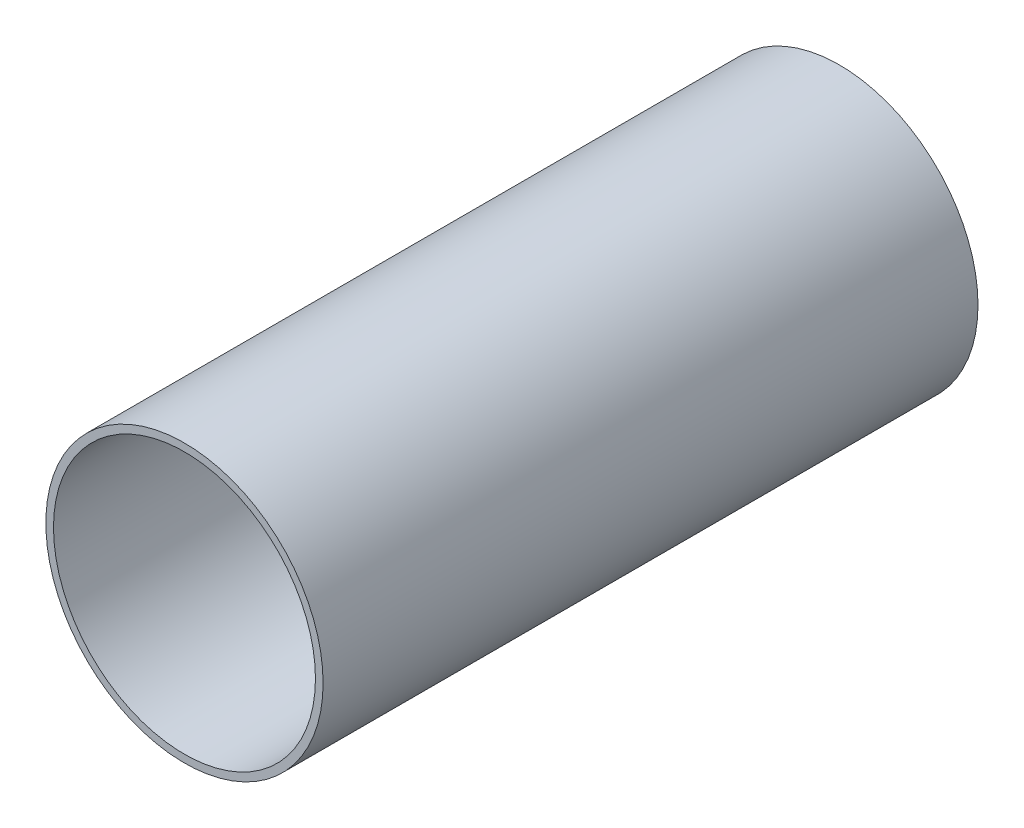
ISO-10303-21;
HEADER;
FILE_DESCRIPTION(('STEP AP214'),'2;1');
FILE_NAME('part.step','',(''),(''),'','','');
FILE_SCHEMA(('AUTOMOTIVE_DESIGN { 1 0 10303 214 1 1 1 1 }'));
ENDSEC;
DATA;
#1=APPLICATION_CONTEXT('core data for automotive mechanical design processes');
#2=APPLICATION_PROTOCOL_DEFINITION('international standard','automotive_design',2000,#1);
#3=PRODUCT_CONTEXT('',#1,'mechanical');
#4=PRODUCT('Part','Part','',(#3));
#5=PRODUCT_RELATED_PRODUCT_CATEGORY('part','',(#4));
#6=PRODUCT_DEFINITION_FORMATION('','',#4);
#7=PRODUCT_DEFINITION_CONTEXT('part definition',#1,'design');
#8=PRODUCT_DEFINITION('design','',#6,#7);
#9=PRODUCT_DEFINITION_SHAPE('','',#8);
#10=(LENGTH_UNIT() NAMED_UNIT(*) SI_UNIT(.MILLI.,.METRE.));
#11=(NAMED_UNIT(*) PLANE_ANGLE_UNIT() SI_UNIT($,.RADIAN.));
#12=(NAMED_UNIT(*) SI_UNIT($,.STERADIAN.) SOLID_ANGLE_UNIT());
#13=UNCERTAINTY_MEASURE_WITH_UNIT(LENGTH_MEASURE(1.E-05),#10,'distance_accuracy_value','');
#14=(GEOMETRIC_REPRESENTATION_CONTEXT(3) GLOBAL_UNCERTAINTY_ASSIGNED_CONTEXT((#13)) GLOBAL_UNIT_ASSIGNED_CONTEXT((#10,
#11,#12)) REPRESENTATION_CONTEXT('',''));
#15=CARTESIAN_POINT('',(0.,0.,0.));
#16=DIRECTION('',(0.,0.,1.));
#17=DIRECTION('',(1.,0.,0.));
#18=AXIS2_PLACEMENT_3D('',#15,#16,#17);
#19=CARTESIAN_POINT('',(0.,0.,30.));
#20=DIRECTION('',(0.,0.,1.));
#21=DIRECTION('',(1.,0.,0.));
#22=AXIS2_PLACEMENT_3D('',#19,#20,#21);
#23=PLANE('',#22);
#24=CARTESIAN_POINT('',(0.,0.,30.));
#25=DIRECTION('',(0.,0.,1.));
#26=DIRECTION('',(1.,0.,0.));
#27=AXIS2_PLACEMENT_3D('',#24,#25,#26);
#28=CIRCLE('',#27,6.35);
#29=CARTESIAN_POINT('',(6.35,0.,30.));
#30=VERTEX_POINT('',#29);
#31=EDGE_CURVE('E10',#30,#30,#28,.T.);
#32=ORIENTED_EDGE('',*,*,#31,.T.);
#33=EDGE_LOOP('',(#32));
#34=FACE_BOUND('',#33,.T.);
#35=CARTESIAN_POINT('',(0.,0.,30.));
#36=DIRECTION('',(0.,0.,1.));
#37=DIRECTION('',(1.,0.,0.));
#38=AXIS2_PLACEMENT_3D('',#35,#36,#37);
#39=CIRCLE('',#38,6.);
#40=CARTESIAN_POINT('',(6.,0.,30.));
#41=VERTEX_POINT('',#40);
#42=EDGE_CURVE('E41',#41,#41,#39,.T.);
#43=ORIENTED_EDGE('',*,*,#42,.F.);
#44=EDGE_LOOP('',(#43));
#45=FACE_BOUND('',#44,.T.);
#46=ADVANCED_FACE('F30',(#34,#45),#23,.T.);
#47=CARTESIAN_POINT('',(0.,0.,0.));
#48=DIRECTION('',(0.,0.,1.));
#49=DIRECTION('',(1.,0.,0.));
#50=AXIS2_PLACEMENT_3D('',#47,#48,#49);
#51=PLANE('',#50);
#52=CARTESIAN_POINT('',(0.,0.,0.));
#53=DIRECTION('',(0.,0.,1.));
#54=DIRECTION('',(1.,0.,0.));
#55=AXIS2_PLACEMENT_3D('',#52,#53,#54);
#56=CIRCLE('',#55,6.35);
#57=CARTESIAN_POINT('',(6.35,0.,0.));
#58=VERTEX_POINT('',#57);
#59=EDGE_CURVE('E34',#58,#58,#56,.T.);
#60=ORIENTED_EDGE('',*,*,#59,.F.);
#61=EDGE_LOOP('',(#60));
#62=FACE_BOUND('',#61,.T.);
#63=CARTESIAN_POINT('',(0.,0.,0.));
#64=DIRECTION('',(0.,0.,1.));
#65=DIRECTION('',(1.,0.,0.));
#66=AXIS2_PLACEMENT_3D('',#63,#64,#65);
#67=CIRCLE('',#66,6.);
#68=CARTESIAN_POINT('',(6.,0.,0.));
#69=VERTEX_POINT('',#68);
#70=EDGE_CURVE('E43',#69,#69,#67,.T.);
#71=ORIENTED_EDGE('',*,*,#70,.T.);
#72=EDGE_LOOP('',(#71));
#73=FACE_BOUND('',#72,.T.);
#74=ADVANCED_FACE('F53',(#62,#73),#51,.F.);
#75=CARTESIAN_POINT('',(0.,0.,30.));
#76=DIRECTION('',(0.,0.,-1.));
#77=DIRECTION('',(-1.,0.,0.));
#78=AXIS2_PLACEMENT_3D('',#75,#76,#77);
#79=CYLINDRICAL_SURFACE('',#78,6.35);
#80=ORIENTED_EDGE('',*,*,#31,.F.);
#81=EDGE_LOOP('',(#80));
#82=FACE_BOUND('',#81,.T.);
#83=ORIENTED_EDGE('',*,*,#59,.T.);
#84=EDGE_LOOP('',(#83));
#85=FACE_BOUND('',#84,.T.);
#86=ADVANCED_FACE('F32',(#82,#85),#79,.T.);
#87=CARTESIAN_POINT('',(0.,0.,30.));
#88=DIRECTION('',(0.,0.,-1.));
#89=DIRECTION('',(-1.,0.,0.));
#90=AXIS2_PLACEMENT_3D('',#87,#88,#89);
#91=CYLINDRICAL_SURFACE('',#90,6.);
#92=ORIENTED_EDGE('',*,*,#42,.T.);
#93=EDGE_LOOP('',(#92));
#94=FACE_BOUND('',#93,.T.);
#95=ORIENTED_EDGE('',*,*,#70,.F.);
#96=EDGE_LOOP('',(#95));
#97=FACE_BOUND('',#96,.T.);
#98=ADVANCED_FACE('F49',(#94,#97),#91,.F.);
#99=CLOSED_SHELL('',(#46,#74,#86,#98));
#100=MANIFOLD_SOLID_BREP('B2',#99);
#101=ADVANCED_BREP_SHAPE_REPRESENTATION('',(#18,#100),#14);
#102=SHAPE_DEFINITION_REPRESENTATION(#9,#101);
ENDSEC;
END-ISO-10303-21;
